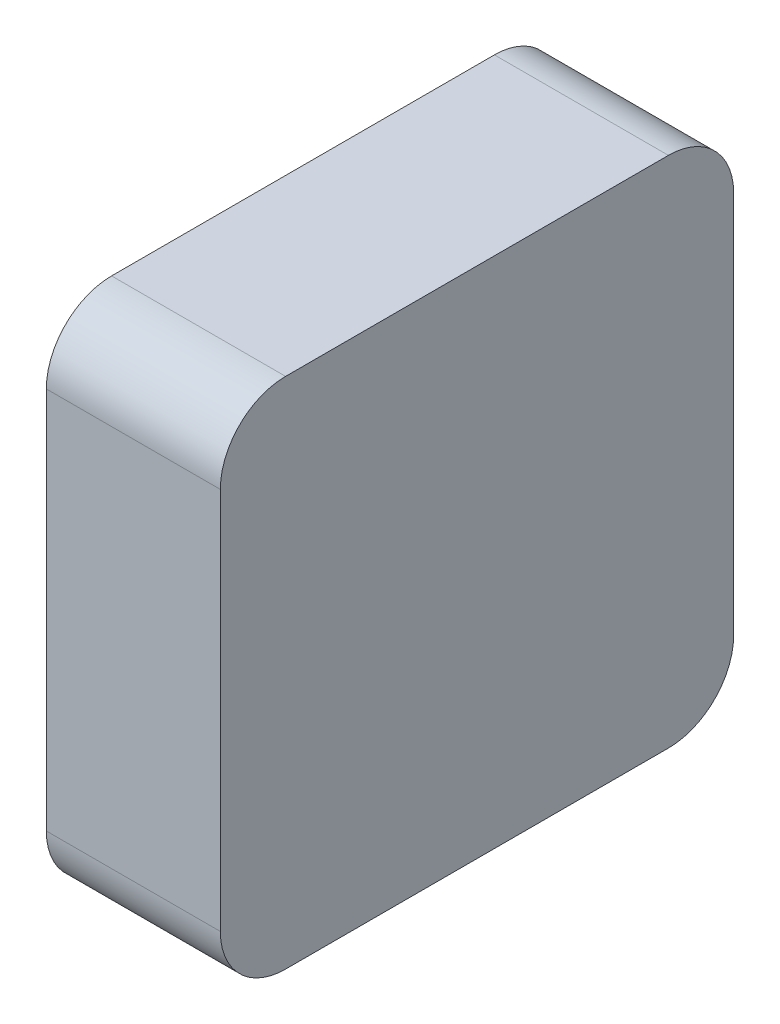
ISO-10303-21;
HEADER;
FILE_DESCRIPTION(('STEP AP214'),'2;1');
FILE_NAME('part.step','',(''),(''),'','','');
FILE_SCHEMA(('AUTOMOTIVE_DESIGN { 1 0 10303 214 1 1 1 1 }'));
ENDSEC;
DATA;
#1=APPLICATION_CONTEXT('core data for automotive mechanical design processes');
#2=APPLICATION_PROTOCOL_DEFINITION('international standard','automotive_design',2000,#1);
#3=PRODUCT_CONTEXT('',#1,'mechanical');
#4=PRODUCT('Part','Part','',(#3));
#5=PRODUCT_RELATED_PRODUCT_CATEGORY('part','',(#4));
#6=PRODUCT_DEFINITION_FORMATION('','',#4);
#7=PRODUCT_DEFINITION_CONTEXT('part definition',#1,'design');
#8=PRODUCT_DEFINITION('design','',#6,#7);
#9=PRODUCT_DEFINITION_SHAPE('','',#8);
#10=(LENGTH_UNIT() NAMED_UNIT(*) SI_UNIT(.MILLI.,.METRE.));
#11=(NAMED_UNIT(*) PLANE_ANGLE_UNIT() SI_UNIT($,.RADIAN.));
#12=(NAMED_UNIT(*) SI_UNIT($,.STERADIAN.) SOLID_ANGLE_UNIT());
#13=UNCERTAINTY_MEASURE_WITH_UNIT(LENGTH_MEASURE(1.E-05),#10,'distance_accuracy_value','');
#14=(GEOMETRIC_REPRESENTATION_CONTEXT(3) GLOBAL_UNCERTAINTY_ASSIGNED_CONTEXT((#13)) GLOBAL_UNIT_ASSIGNED_CONTEXT((#10,
#11,#12)) REPRESENTATION_CONTEXT('',''));
#15=CARTESIAN_POINT('',(0.,0.,0.));
#16=DIRECTION('',(0.,0.,1.));
#17=DIRECTION('',(1.,0.,0.));
#18=AXIS2_PLACEMENT_3D('',#15,#16,#17);
#19=CARTESIAN_POINT('',(10.16,-11.176,-11.176));
#20=DIRECTION('',(-1.,0.,0.));
#21=DIRECTION('',(0.,0.,1.));
#22=AXIS2_PLACEMENT_3D('',#19,#20,#21);
#23=CYLINDRICAL_SURFACE('',#22,3.81);
#24=CARTESIAN_POINT('',(0.,-11.176,-11.176));
#25=DIRECTION('',(1.,0.,0.));
#26=DIRECTION('',(0.,0.,1.));
#27=AXIS2_PLACEMENT_3D('',#24,#25,#26);
#28=CIRCLE('',#27,3.81);
#29=CARTESIAN_POINT('',(0.,-14.986,-11.176));
#30=VERTEX_POINT('',#29);
#31=CARTESIAN_POINT('',(0.,-11.176,-14.986));
#32=VERTEX_POINT('',#31);
#33=EDGE_CURVE('E146',#30,#32,#28,.T.);
#34=ORIENTED_EDGE('',*,*,#33,.T.);
#35=DIRECTION('',(-1.,0.,0.));
#36=VECTOR('',#35,1.);
#37=CARTESIAN_POINT('',(10.16,-11.176,-14.986));
#38=LINE('',#37,#36);
#39=CARTESIAN_POINT('',(10.16,-11.176,-14.986));
#40=VERTEX_POINT('',#39);
#41=EDGE_CURVE('E11',#40,#32,#38,.T.);
#42=ORIENTED_EDGE('',*,*,#41,.F.);
#43=CARTESIAN_POINT('',(10.16,-11.176,-11.176));
#44=DIRECTION('',(1.,0.,0.));
#45=DIRECTION('',(0.,0.,1.));
#46=AXIS2_PLACEMENT_3D('',#43,#44,#45);
#47=CIRCLE('',#46,3.81);
#48=CARTESIAN_POINT('',(10.16,-14.986,-11.176));
#49=VERTEX_POINT('',#48);
#50=EDGE_CURVE('E168',#49,#40,#47,.T.);
#51=ORIENTED_EDGE('',*,*,#50,.F.);
#52=DIRECTION('',(-1.,0.,0.));
#53=VECTOR('',#52,1.);
#54=CARTESIAN_POINT('',(10.16,-14.986,-11.176));
#55=LINE('',#54,#53);
#56=EDGE_CURVE('E142',#49,#30,#55,.T.);
#57=ORIENTED_EDGE('',*,*,#56,.T.);
#58=EDGE_LOOP('',(#34,#42,#51,#57));
#59=FACE_BOUND('',#58,.T.);
#60=ADVANCED_FACE('F45',(#59),#23,.T.);
#61=CARTESIAN_POINT('',(10.16,-11.176,-14.986));
#62=DIRECTION('',(0.,0.,1.));
#63=DIRECTION('',(1.,0.,0.));
#64=AXIS2_PLACEMENT_3D('',#61,#62,#63);
#65=PLANE('',#64);
#66=DIRECTION('',(0.,1.,0.));
#67=VECTOR('',#66,1.);
#68=CARTESIAN_POINT('',(0.,-11.176,-14.986));
#69=LINE('',#68,#67);
#70=CARTESIAN_POINT('',(0.,11.176,-14.986));
#71=VERTEX_POINT('',#70);
#72=EDGE_CURVE('E150',#32,#71,#69,.T.);
#73=ORIENTED_EDGE('',*,*,#72,.T.);
#74=DIRECTION('',(-1.,0.,0.));
#75=VECTOR('',#74,1.);
#76=CARTESIAN_POINT('',(10.16,11.176,-14.986));
#77=LINE('',#76,#75);
#78=CARTESIAN_POINT('',(10.16,11.176,-14.986));
#79=VERTEX_POINT('',#78);
#80=EDGE_CURVE('E54',#79,#71,#77,.T.);
#81=ORIENTED_EDGE('',*,*,#80,.F.);
#82=DIRECTION('',(0.,1.,0.));
#83=VECTOR('',#82,1.);
#84=CARTESIAN_POINT('',(10.16,-11.176,-14.986));
#85=LINE('',#84,#83);
#86=EDGE_CURVE('E105',#40,#79,#85,.T.);
#87=ORIENTED_EDGE('',*,*,#86,.F.);
#88=ORIENTED_EDGE('',*,*,#41,.T.);
#89=EDGE_LOOP('',(#73,#81,#87,#88));
#90=FACE_BOUND('',#89,.T.);
#91=ADVANCED_FACE('F214',(#90),#65,.F.);
#92=CARTESIAN_POINT('',(10.16,11.176,-11.176));
#93=DIRECTION('',(-1.,0.,0.));
#94=DIRECTION('',(0.,0.,1.));
#95=AXIS2_PLACEMENT_3D('',#92,#93,#94);
#96=CYLINDRICAL_SURFACE('',#95,3.81);
#97=CARTESIAN_POINT('',(0.,11.176,-11.176));
#98=DIRECTION('',(1.,0.,0.));
#99=DIRECTION('',(0.,0.,-1.));
#100=AXIS2_PLACEMENT_3D('',#97,#98,#99);
#101=CIRCLE('',#100,3.81);
#102=CARTESIAN_POINT('',(0.,14.986,-11.176));
#103=VERTEX_POINT('',#102);
#104=EDGE_CURVE('E153',#71,#103,#101,.T.);
#105=ORIENTED_EDGE('',*,*,#104,.T.);
#106=DIRECTION('',(-1.,0.,0.));
#107=VECTOR('',#106,1.);
#108=CARTESIAN_POINT('',(10.16,14.986,-11.176));
#109=LINE('',#108,#107);
#110=CARTESIAN_POINT('',(10.16,14.986,-11.176));
#111=VERTEX_POINT('',#110);
#112=EDGE_CURVE('E179',#111,#103,#109,.T.);
#113=ORIENTED_EDGE('',*,*,#112,.F.);
#114=CARTESIAN_POINT('',(10.16,11.176,-11.176));
#115=DIRECTION('',(1.,0.,0.));
#116=DIRECTION('',(0.,0.,-1.));
#117=AXIS2_PLACEMENT_3D('',#114,#115,#116);
#118=CIRCLE('',#117,3.81);
#119=EDGE_CURVE('E189',#79,#111,#118,.T.);
#120=ORIENTED_EDGE('',*,*,#119,.F.);
#121=ORIENTED_EDGE('',*,*,#80,.T.);
#122=EDGE_LOOP('',(#105,#113,#120,#121));
#123=FACE_BOUND('',#122,.T.);
#124=ADVANCED_FACE('F187',(#123),#96,.T.);
#125=CARTESIAN_POINT('',(10.16,14.986,-11.176));
#126=DIRECTION('',(0.,-1.,0.));
#127=DIRECTION('',(0.,0.,-1.));
#128=AXIS2_PLACEMENT_3D('',#125,#126,#127);
#129=PLANE('',#128);
#130=DIRECTION('',(0.,0.,1.));
#131=VECTOR('',#130,1.);
#132=CARTESIAN_POINT('',(0.,14.986,-11.176));
#133=LINE('',#132,#131);
#134=CARTESIAN_POINT('',(0.,14.986,11.176));
#135=VERTEX_POINT('',#134);
#136=EDGE_CURVE('E156',#103,#135,#133,.T.);
#137=ORIENTED_EDGE('',*,*,#136,.T.);
#138=DIRECTION('',(-1.,0.,0.));
#139=VECTOR('',#138,1.);
#140=CARTESIAN_POINT('',(10.16,14.986,11.176));
#141=LINE('',#140,#139);
#142=CARTESIAN_POINT('',(10.16,14.986,11.176));
#143=VERTEX_POINT('',#142);
#144=EDGE_CURVE('E175',#143,#135,#141,.T.);
#145=ORIENTED_EDGE('',*,*,#144,.F.);
#146=DIRECTION('',(0.,0.,1.));
#147=VECTOR('',#146,1.);
#148=CARTESIAN_POINT('',(10.16,14.986,-11.176));
#149=LINE('',#148,#147);
#150=EDGE_CURVE('E202',#111,#143,#149,.T.);
#151=ORIENTED_EDGE('',*,*,#150,.F.);
#152=ORIENTED_EDGE('',*,*,#112,.T.);
#153=EDGE_LOOP('',(#137,#145,#151,#152));
#154=FACE_BOUND('',#153,.T.);
#155=ADVANCED_FACE('F197',(#154),#129,.F.);
#156=CARTESIAN_POINT('',(10.16,11.176,11.176));
#157=DIRECTION('',(-1.,0.,0.));
#158=DIRECTION('',(0.,0.,1.));
#159=AXIS2_PLACEMENT_3D('',#156,#157,#158);
#160=CYLINDRICAL_SURFACE('',#159,3.81);
#161=CARTESIAN_POINT('',(0.,11.176,11.176));
#162=DIRECTION('',(1.,0.,0.));
#163=DIRECTION('',(0.,0.,1.));
#164=AXIS2_PLACEMENT_3D('',#161,#162,#163);
#165=CIRCLE('',#164,3.81);
#166=CARTESIAN_POINT('',(0.,11.176,14.986));
#167=VERTEX_POINT('',#166);
#168=EDGE_CURVE('E159',#135,#167,#165,.T.);
#169=ORIENTED_EDGE('',*,*,#168,.T.);
#170=DIRECTION('',(-1.,0.,0.));
#171=VECTOR('',#170,1.);
#172=CARTESIAN_POINT('',(10.16,11.176,14.986));
#173=LINE('',#172,#171);
#174=CARTESIAN_POINT('',(10.16,11.176,14.986));
#175=VERTEX_POINT('',#174);
#176=EDGE_CURVE('E135',#175,#167,#173,.T.);
#177=ORIENTED_EDGE('',*,*,#176,.F.);
#178=CARTESIAN_POINT('',(10.16,11.176,11.176));
#179=DIRECTION('',(1.,0.,0.));
#180=DIRECTION('',(0.,0.,1.));
#181=AXIS2_PLACEMENT_3D('',#178,#179,#180);
#182=CIRCLE('',#181,3.81);
#183=EDGE_CURVE('E124',#143,#175,#182,.T.);
#184=ORIENTED_EDGE('',*,*,#183,.F.);
#185=ORIENTED_EDGE('',*,*,#144,.T.);
#186=EDGE_LOOP('',(#169,#177,#184,#185));
#187=FACE_BOUND('',#186,.T.);
#188=ADVANCED_FACE('F200',(#187),#160,.T.);
#189=CARTESIAN_POINT('',(10.16,-11.176,14.986));
#190=DIRECTION('',(0.,0.,-1.));
#191=DIRECTION('',(-1.,0.,0.));
#192=AXIS2_PLACEMENT_3D('',#189,#190,#191);
#193=PLANE('',#192);
#194=DIRECTION('',(0.,-1.,0.));
#195=VECTOR('',#194,1.);
#196=CARTESIAN_POINT('',(0.,-11.176,14.986));
#197=LINE('',#196,#195);
#198=CARTESIAN_POINT('',(0.,-11.176,14.986));
#199=VERTEX_POINT('',#198);
#200=EDGE_CURVE('E133',#167,#199,#197,.T.);
#201=ORIENTED_EDGE('',*,*,#200,.T.);
#202=DIRECTION('',(-1.,0.,0.));
#203=VECTOR('',#202,1.);
#204=CARTESIAN_POINT('',(10.16,-11.176,14.986));
#205=LINE('',#204,#203);
#206=CARTESIAN_POINT('',(10.16,-11.176,14.986));
#207=VERTEX_POINT('',#206);
#208=EDGE_CURVE('E130',#207,#199,#205,.T.);
#209=ORIENTED_EDGE('',*,*,#208,.F.);
#210=DIRECTION('',(0.,-1.,0.));
#211=VECTOR('',#210,1.);
#212=CARTESIAN_POINT('',(10.16,-11.176,14.986));
#213=LINE('',#212,#211);
#214=EDGE_CURVE('E118',#175,#207,#213,.T.);
#215=ORIENTED_EDGE('',*,*,#214,.F.);
#216=ORIENTED_EDGE('',*,*,#176,.T.);
#217=EDGE_LOOP('',(#201,#209,#215,#216));
#218=FACE_BOUND('',#217,.T.);
#219=ADVANCED_FACE('F131',(#218),#193,.F.);
#220=CARTESIAN_POINT('',(10.16,-11.176,11.176));
#221=DIRECTION('',(-1.,0.,0.));
#222=DIRECTION('',(0.,0.,1.));
#223=AXIS2_PLACEMENT_3D('',#220,#221,#222);
#224=CYLINDRICAL_SURFACE('',#223,3.81);
#225=CARTESIAN_POINT('',(0.,-11.176,11.176));
#226=DIRECTION('',(1.,0.,0.));
#227=DIRECTION('',(0.,0.,1.));
#228=AXIS2_PLACEMENT_3D('',#225,#226,#227);
#229=CIRCLE('',#228,3.81);
#230=CARTESIAN_POINT('',(0.,-14.986,11.176));
#231=VERTEX_POINT('',#230);
#232=EDGE_CURVE('E91',#199,#231,#229,.T.);
#233=ORIENTED_EDGE('',*,*,#232,.T.);
#234=DIRECTION('',(-1.,0.,0.));
#235=VECTOR('',#234,1.);
#236=CARTESIAN_POINT('',(10.16,-14.986,11.176));
#237=LINE('',#236,#235);
#238=CARTESIAN_POINT('',(10.16,-14.986,11.176));
#239=VERTEX_POINT('',#238);
#240=EDGE_CURVE('E136',#239,#231,#237,.T.);
#241=ORIENTED_EDGE('',*,*,#240,.F.);
#242=CARTESIAN_POINT('',(10.16,-11.176,11.176));
#243=DIRECTION('',(1.,0.,0.));
#244=DIRECTION('',(0.,0.,1.));
#245=AXIS2_PLACEMENT_3D('',#242,#243,#244);
#246=CIRCLE('',#245,3.81);
#247=EDGE_CURVE('E122',#207,#239,#246,.T.);
#248=ORIENTED_EDGE('',*,*,#247,.F.);
#249=ORIENTED_EDGE('',*,*,#208,.T.);
#250=EDGE_LOOP('',(#233,#241,#248,#249));
#251=FACE_BOUND('',#250,.T.);
#252=ADVANCED_FACE('F138',(#251),#224,.T.);
#253=CARTESIAN_POINT('',(10.16,-14.986,-11.176));
#254=DIRECTION('',(0.,1.,0.));
#255=DIRECTION('',(0.,0.,1.));
#256=AXIS2_PLACEMENT_3D('',#253,#254,#255);
#257=PLANE('',#256);
#258=DIRECTION('',(0.,0.,-1.));
#259=VECTOR('',#258,1.);
#260=CARTESIAN_POINT('',(0.,-14.986,-11.176));
#261=LINE('',#260,#259);
#262=EDGE_CURVE('E97',#231,#30,#261,.T.);
#263=ORIENTED_EDGE('',*,*,#262,.T.);
#264=ORIENTED_EDGE('',*,*,#56,.F.);
#265=DIRECTION('',(0.,0.,-1.));
#266=VECTOR('',#265,1.);
#267=CARTESIAN_POINT('',(10.16,-14.986,-11.176));
#268=LINE('',#267,#266);
#269=EDGE_CURVE('E62',#239,#49,#268,.T.);
#270=ORIENTED_EDGE('',*,*,#269,.F.);
#271=ORIENTED_EDGE('',*,*,#240,.T.);
#272=EDGE_LOOP('',(#263,#264,#270,#271));
#273=FACE_BOUND('',#272,.T.);
#274=ADVANCED_FACE('F230',(#273),#257,.F.);
#275=CARTESIAN_POINT('',(10.16,-11.176,-11.176));
#276=DIRECTION('',(-1.,0.,0.));
#277=DIRECTION('',(0.,0.,1.));
#278=AXIS2_PLACEMENT_3D('',#275,#276,#277);
#279=PLANE('',#278);
#280=ORIENTED_EDGE('',*,*,#50,.T.);
#281=ORIENTED_EDGE('',*,*,#86,.T.);
#282=ORIENTED_EDGE('',*,*,#119,.T.);
#283=ORIENTED_EDGE('',*,*,#150,.T.);
#284=ORIENTED_EDGE('',*,*,#183,.T.);
#285=ORIENTED_EDGE('',*,*,#214,.T.);
#286=ORIENTED_EDGE('',*,*,#247,.T.);
#287=ORIENTED_EDGE('',*,*,#269,.T.);
#288=EDGE_LOOP('',(#280,#281,#282,#283,#284,#285,#286,#287));
#289=FACE_BOUND('',#288,.T.);
#290=ADVANCED_FACE('F120',(#289),#279,.F.);
#291=CARTESIAN_POINT('',(0.,-11.176,-11.176));
#292=DIRECTION('',(-1.,0.,0.));
#293=DIRECTION('',(0.,0.,1.));
#294=AXIS2_PLACEMENT_3D('',#291,#292,#293);
#295=PLANE('',#294);
#296=ORIENTED_EDGE('',*,*,#33,.F.);
#297=ORIENTED_EDGE('',*,*,#262,.F.);
#298=ORIENTED_EDGE('',*,*,#232,.F.);
#299=ORIENTED_EDGE('',*,*,#200,.F.);
#300=ORIENTED_EDGE('',*,*,#168,.F.);
#301=ORIENTED_EDGE('',*,*,#136,.F.);
#302=ORIENTED_EDGE('',*,*,#104,.F.);
#303=ORIENTED_EDGE('',*,*,#72,.F.);
#304=EDGE_LOOP('',(#296,#297,#298,#299,#300,#301,#302,#303));
#305=FACE_BOUND('',#304,.T.);
#306=ADVANCED_FACE('F193',(#305),#295,.T.);
#307=CLOSED_SHELL('',(#60,#91,#124,#155,#188,#219,#252,#274,#290,#306));
#308=MANIFOLD_SOLID_BREP('B2',#307);
#309=ADVANCED_BREP_SHAPE_REPRESENTATION('',(#18,#308),#14);
#310=SHAPE_DEFINITION_REPRESENTATION(#9,#309);
ENDSEC;
END-ISO-10303-21;
